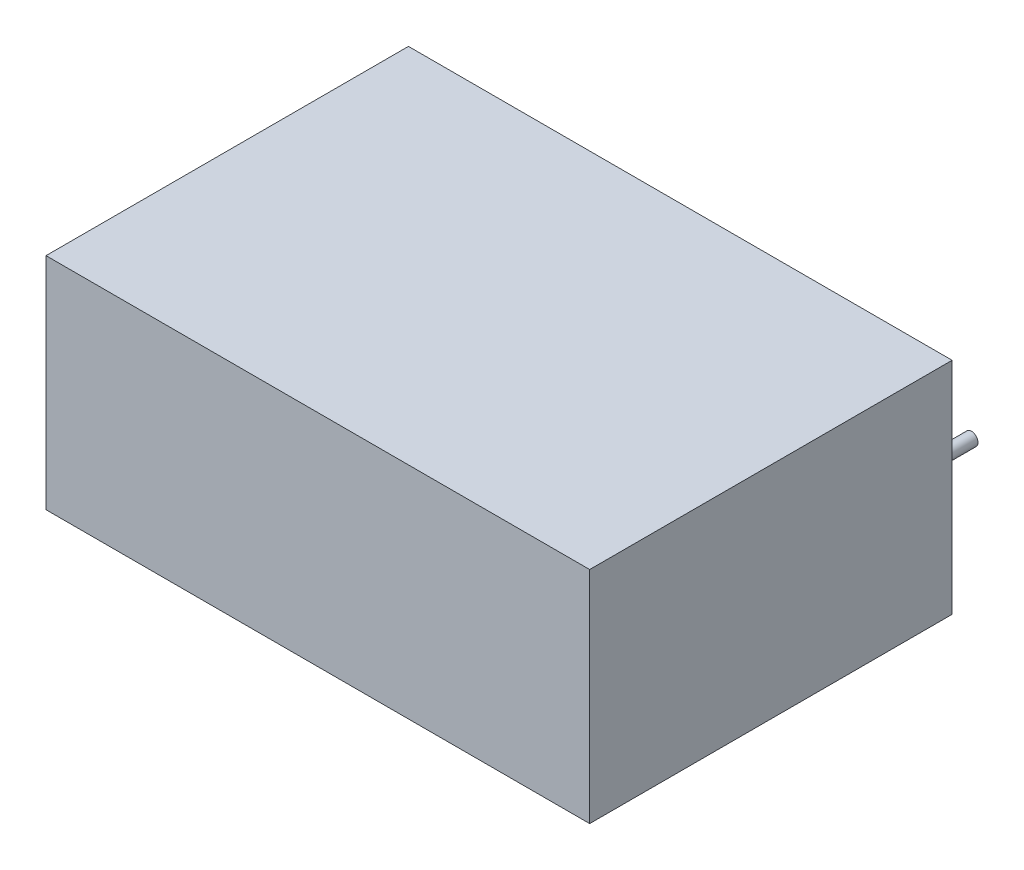
ISO-10303-21;
HEADER;
FILE_DESCRIPTION(('STEP AP214'),'2;1');
FILE_NAME('part.step','',(''),(''),'','','');
FILE_SCHEMA(('AUTOMOTIVE_DESIGN { 1 0 10303 214 1 1 1 1 }'));
ENDSEC;
DATA;
#1=APPLICATION_CONTEXT('core data for automotive mechanical design processes');
#2=APPLICATION_PROTOCOL_DEFINITION('international standard','automotive_design',2000,#1);
#3=PRODUCT_CONTEXT('',#1,'mechanical');
#4=PRODUCT('Part','Part','',(#3));
#5=PRODUCT_RELATED_PRODUCT_CATEGORY('part','',(#4));
#6=PRODUCT_DEFINITION_FORMATION('','',#4);
#7=PRODUCT_DEFINITION_CONTEXT('part definition',#1,'design');
#8=PRODUCT_DEFINITION('design','',#6,#7);
#9=PRODUCT_DEFINITION_SHAPE('','',#8);
#10=(LENGTH_UNIT() NAMED_UNIT(*) SI_UNIT(.MILLI.,.METRE.));
#11=(NAMED_UNIT(*) PLANE_ANGLE_UNIT() SI_UNIT($,.RADIAN.));
#12=(NAMED_UNIT(*) SI_UNIT($,.STERADIAN.) SOLID_ANGLE_UNIT());
#13=UNCERTAINTY_MEASURE_WITH_UNIT(LENGTH_MEASURE(1.E-05),#10,'distance_accuracy_value','');
#14=(GEOMETRIC_REPRESENTATION_CONTEXT(3) GLOBAL_UNCERTAINTY_ASSIGNED_CONTEXT((#13)) GLOBAL_UNIT_ASSIGNED_CONTEXT((#10,
#11,#12)) REPRESENTATION_CONTEXT('',''));
#15=CARTESIAN_POINT('',(0.,0.,0.));
#16=DIRECTION('',(0.,0.,1.));
#17=DIRECTION('',(1.,0.,0.));
#18=AXIS2_PLACEMENT_3D('',#15,#16,#17);
#19=CARTESIAN_POINT('',(-0.5,8.,0.));
#20=DIRECTION('',(0.,0.,1.));
#21=DIRECTION('',(1.,0.,0.));
#22=AXIS2_PLACEMENT_3D('',#19,#20,#21);
#23=PLANE('',#22);
#24=CARTESIAN_POINT('',(2.,-0.499999999999992,0.));
#25=DIRECTION('',(0.,0.,1.));
#26=DIRECTION('',(1.,0.,0.));
#27=AXIS2_PLACEMENT_3D('',#24,#25,#26);
#28=CIRCLE('',#27,0.499999999999999);
#29=CARTESIAN_POINT('',(2.5,-0.499999999999992,0.));
#30=VERTEX_POINT('',#29);
#31=EDGE_CURVE('E40',#30,#30,#28,.F.);
#32=ORIENTED_EDGE('',*,*,#31,.F.);
#33=EDGE_LOOP('',(#32));
#34=FACE_BOUND('',#33,.T.);
#35=DIRECTION('',(-1.,0.,0.));
#36=VECTOR('',#35,1.);
#37=CARTESIAN_POINT('',(41.5,8.00000000000001,0.));
#38=LINE('',#37,#36);
#39=CARTESIAN_POINT('',(41.5,8.00000000000001,0.));
#40=VERTEX_POINT('',#39);
#41=CARTESIAN_POINT('',(-0.5,8.,0.));
#42=VERTEX_POINT('',#41);
#43=EDGE_CURVE('E99',#40,#42,#38,.T.);
#44=ORIENTED_EDGE('',*,*,#43,.F.);
#45=DIRECTION('',(0.,1.,0.));
#46=VECTOR('',#45,1.);
#47=CARTESIAN_POINT('',(41.5,-9.,0.));
#48=LINE('',#47,#46);
#49=CARTESIAN_POINT('',(41.5,-9.,0.));
#50=VERTEX_POINT('',#49);
#51=EDGE_CURVE('E71',#50,#40,#48,.T.);
#52=ORIENTED_EDGE('',*,*,#51,.F.);
#53=DIRECTION('',(1.,0.,0.));
#54=VECTOR('',#53,1.);
#55=CARTESIAN_POINT('',(-0.499999999999999,-9.,0.));
#56=LINE('',#55,#54);
#57=CARTESIAN_POINT('',(-0.499999999999999,-9.,0.));
#58=VERTEX_POINT('',#57);
#59=EDGE_CURVE('E65',#58,#50,#56,.T.);
#60=ORIENTED_EDGE('',*,*,#59,.F.);
#61=DIRECTION('',(0.,-1.,0.));
#62=VECTOR('',#61,1.);
#63=CARTESIAN_POINT('',(-0.5,8.,0.));
#64=LINE('',#63,#62);
#65=EDGE_CURVE('E89',#42,#58,#64,.T.);
#66=ORIENTED_EDGE('',*,*,#65,.F.);
#67=EDGE_LOOP('',(#44,#52,#60,#66));
#68=FACE_BOUND('',#67,.T.);
#69=CARTESIAN_POINT('',(39.,-0.499999999999997,0.));
#70=DIRECTION('',(0.,0.,1.));
#71=DIRECTION('',(1.,0.,0.));
#72=AXIS2_PLACEMENT_3D('',#69,#70,#71);
#73=CIRCLE('',#72,0.499999999999999);
#74=CARTESIAN_POINT('',(39.5,-0.499999999999997,0.));
#75=VERTEX_POINT('',#74);
#76=EDGE_CURVE('E11',#75,#75,#73,.F.);
#77=ORIENTED_EDGE('',*,*,#76,.F.);
#78=EDGE_LOOP('',(#77));
#79=FACE_BOUND('',#78,.T.);
#80=ADVANCED_FACE('F31',(#34,#68,#79),#23,.F.);
#81=CARTESIAN_POINT('',(41.5,8.00000000000001,28.));
#82=DIRECTION('',(0.,-1.,0.));
#83=DIRECTION('',(1.,0.,0.));
#84=AXIS2_PLACEMENT_3D('',#81,#82,#83);
#85=PLANE('',#84);
#86=ORIENTED_EDGE('',*,*,#43,.T.);
#87=DIRECTION('',(0.,0.,-1.));
#88=VECTOR('',#87,1.);
#89=CARTESIAN_POINT('',(-0.5,8.,28.));
#90=LINE('',#89,#88);
#91=CARTESIAN_POINT('',(-0.5,8.,28.));
#92=VERTEX_POINT('',#91);
#93=EDGE_CURVE('E90',#92,#42,#90,.T.);
#94=ORIENTED_EDGE('',*,*,#93,.F.);
#95=DIRECTION('',(-1.,0.,0.));
#96=VECTOR('',#95,1.);
#97=CARTESIAN_POINT('',(41.5,8.00000000000001,28.));
#98=LINE('',#97,#96);
#99=CARTESIAN_POINT('',(41.5,8.00000000000001,28.));
#100=VERTEX_POINT('',#99);
#101=EDGE_CURVE('E84',#100,#92,#98,.T.);
#102=ORIENTED_EDGE('',*,*,#101,.F.);
#103=DIRECTION('',(0.,0.,-1.));
#104=VECTOR('',#103,1.);
#105=CARTESIAN_POINT('',(41.5,8.00000000000001,28.));
#106=LINE('',#105,#104);
#107=EDGE_CURVE('E95',#100,#40,#106,.T.);
#108=ORIENTED_EDGE('',*,*,#107,.T.);
#109=EDGE_LOOP('',(#86,#94,#102,#108));
#110=FACE_BOUND('',#109,.T.);
#111=ADVANCED_FACE('F33',(#110),#85,.F.);
#112=CARTESIAN_POINT('',(-0.5,8.,28.));
#113=DIRECTION('',(1.,0.,0.));
#114=DIRECTION('',(0.,1.,0.));
#115=AXIS2_PLACEMENT_3D('',#112,#113,#114);
#116=PLANE('',#115);
#117=ORIENTED_EDGE('',*,*,#65,.T.);
#118=DIRECTION('',(0.,0.,-1.));
#119=VECTOR('',#118,1.);
#120=CARTESIAN_POINT('',(-0.499999999999999,-9.,28.));
#121=LINE('',#120,#119);
#122=CARTESIAN_POINT('',(-0.499999999999999,-9.,28.));
#123=VERTEX_POINT('',#122);
#124=EDGE_CURVE('E87',#123,#58,#121,.T.);
#125=ORIENTED_EDGE('',*,*,#124,.F.);
#126=DIRECTION('',(0.,-1.,0.));
#127=VECTOR('',#126,1.);
#128=CARTESIAN_POINT('',(-0.5,8.,28.));
#129=LINE('',#128,#127);
#130=EDGE_CURVE('E79',#92,#123,#129,.T.);
#131=ORIENTED_EDGE('',*,*,#130,.F.);
#132=ORIENTED_EDGE('',*,*,#93,.T.);
#133=EDGE_LOOP('',(#117,#125,#131,#132));
#134=FACE_BOUND('',#133,.T.);
#135=ADVANCED_FACE('F88',(#134),#116,.F.);
#136=CARTESIAN_POINT('',(-0.499999999999999,-9.,28.));
#137=DIRECTION('',(0.,1.,0.));
#138=DIRECTION('',(0.,0.,1.));
#139=AXIS2_PLACEMENT_3D('',#136,#137,#138);
#140=PLANE('',#139);
#141=ORIENTED_EDGE('',*,*,#59,.T.);
#142=DIRECTION('',(0.,0.,-1.));
#143=VECTOR('',#142,1.);
#144=CARTESIAN_POINT('',(41.5,-9.,28.));
#145=LINE('',#144,#143);
#146=CARTESIAN_POINT('',(41.5,-9.,28.));
#147=VERTEX_POINT('',#146);
#148=EDGE_CURVE('E91',#147,#50,#145,.T.);
#149=ORIENTED_EDGE('',*,*,#148,.F.);
#150=DIRECTION('',(1.,0.,0.));
#151=VECTOR('',#150,1.);
#152=CARTESIAN_POINT('',(-0.499999999999999,-9.,28.));
#153=LINE('',#152,#151);
#154=EDGE_CURVE('E82',#123,#147,#153,.T.);
#155=ORIENTED_EDGE('',*,*,#154,.F.);
#156=ORIENTED_EDGE('',*,*,#124,.T.);
#157=EDGE_LOOP('',(#141,#149,#155,#156));
#158=FACE_BOUND('',#157,.T.);
#159=ADVANCED_FACE('F93',(#158),#140,.F.);
#160=CARTESIAN_POINT('',(41.5,-9.,28.));
#161=DIRECTION('',(-1.,0.,0.));
#162=DIRECTION('',(0.,0.,1.));
#163=AXIS2_PLACEMENT_3D('',#160,#161,#162);
#164=PLANE('',#163);
#165=ORIENTED_EDGE('',*,*,#51,.T.);
#166=ORIENTED_EDGE('',*,*,#107,.F.);
#167=DIRECTION('',(0.,1.,0.));
#168=VECTOR('',#167,1.);
#169=CARTESIAN_POINT('',(41.5,-9.,28.));
#170=LINE('',#169,#168);
#171=EDGE_CURVE('E48',#147,#100,#170,.T.);
#172=ORIENTED_EDGE('',*,*,#171,.F.);
#173=ORIENTED_EDGE('',*,*,#148,.T.);
#174=EDGE_LOOP('',(#165,#166,#172,#173));
#175=FACE_BOUND('',#174,.T.);
#176=ADVANCED_FACE('F140',(#175),#164,.F.);
#177=CARTESIAN_POINT('',(-0.5,8.,28.));
#178=DIRECTION('',(0.,0.,1.));
#179=DIRECTION('',(1.,0.,0.));
#180=AXIS2_PLACEMENT_3D('',#177,#178,#179);
#181=PLANE('',#180);
#182=ORIENTED_EDGE('',*,*,#101,.T.);
#183=ORIENTED_EDGE('',*,*,#130,.T.);
#184=ORIENTED_EDGE('',*,*,#154,.T.);
#185=ORIENTED_EDGE('',*,*,#171,.T.);
#186=EDGE_LOOP('',(#182,#183,#184,#185));
#187=FACE_BOUND('',#186,.T.);
#188=ADVANCED_FACE('F80',(#187),#181,.T.);
#189=CARTESIAN_POINT('',(2.,-0.499999999999992,-4.));
#190=DIRECTION('',(0.,0.,1.));
#191=DIRECTION('',(1.,0.,0.));
#192=AXIS2_PLACEMENT_3D('',#189,#190,#191);
#193=CYLINDRICAL_SURFACE('',#192,0.499999999999999);
#194=CARTESIAN_POINT('',(2.,-0.499999999999992,-4.));
#195=DIRECTION('',(0.,0.,-1.));
#196=DIRECTION('',(-1.,0.,0.));
#197=AXIS2_PLACEMENT_3D('',#194,#195,#196);
#198=CIRCLE('',#197,0.499999999999999);
#199=CARTESIAN_POINT('',(1.5,-0.499999999999992,-4.));
#200=VERTEX_POINT('',#199);
#201=EDGE_CURVE('E102',#200,#200,#198,.T.);
#202=ORIENTED_EDGE('',*,*,#201,.F.);
#203=EDGE_LOOP('',(#202));
#204=FACE_BOUND('',#203,.T.);
#205=ORIENTED_EDGE('',*,*,#31,.T.);
#206=EDGE_LOOP('',(#205));
#207=FACE_BOUND('',#206,.T.);
#208=ADVANCED_FACE('F111',(#204,#207),#193,.T.);
#209=CARTESIAN_POINT('',(2.,-0.499999999999992,-4.));
#210=DIRECTION('',(0.,0.,-1.));
#211=DIRECTION('',(-1.,0.,0.));
#212=AXIS2_PLACEMENT_3D('',#209,#210,#211);
#213=PLANE('',#212);
#214=ORIENTED_EDGE('',*,*,#201,.T.);
#215=EDGE_LOOP('',(#214));
#216=FACE_BOUND('',#215,.T.);
#217=ADVANCED_FACE('F123',(#216),#213,.T.);
#218=CARTESIAN_POINT('',(39.,-0.499999999999997,-4.));
#219=DIRECTION('',(0.,0.,1.));
#220=DIRECTION('',(1.,0.,0.));
#221=AXIS2_PLACEMENT_3D('',#218,#219,#220);
#222=CYLINDRICAL_SURFACE('',#221,0.499999999999999);
#223=CARTESIAN_POINT('',(39.,-0.499999999999997,-4.));
#224=DIRECTION('',(0.,0.,-1.));
#225=DIRECTION('',(1.,0.,0.));
#226=AXIS2_PLACEMENT_3D('',#223,#224,#225);
#227=CIRCLE('',#226,0.499999999999999);
#228=CARTESIAN_POINT('',(39.5,-0.499999999999997,-4.));
#229=VERTEX_POINT('',#228);
#230=EDGE_CURVE('E155',#229,#229,#227,.T.);
#231=ORIENTED_EDGE('',*,*,#230,.F.);
#232=EDGE_LOOP('',(#231));
#233=FACE_BOUND('',#232,.T.);
#234=ORIENTED_EDGE('',*,*,#76,.T.);
#235=EDGE_LOOP('',(#234));
#236=FACE_BOUND('',#235,.T.);
#237=ADVANCED_FACE('F120',(#233,#236),#222,.T.);
#238=CARTESIAN_POINT('',(39.,-0.499999999999997,-4.));
#239=DIRECTION('',(0.,0.,1.));
#240=DIRECTION('',(1.,0.,0.));
#241=AXIS2_PLACEMENT_3D('',#238,#239,#240);
#242=PLANE('',#241);
#243=ORIENTED_EDGE('',*,*,#230,.T.);
#244=EDGE_LOOP('',(#243));
#245=FACE_BOUND('',#244,.T.);
#246=ADVANCED_FACE('F122',(#245),#242,.F.);
#247=CLOSED_SHELL('',(#80,#111,#135,#159,#176,#188,#208,#217,#237,#246));
#248=MANIFOLD_SOLID_BREP('B2',#247);
#249=ADVANCED_BREP_SHAPE_REPRESENTATION('',(#18,#248),#14);
#250=SHAPE_DEFINITION_REPRESENTATION(#9,#249);
ENDSEC;
END-ISO-10303-21;
